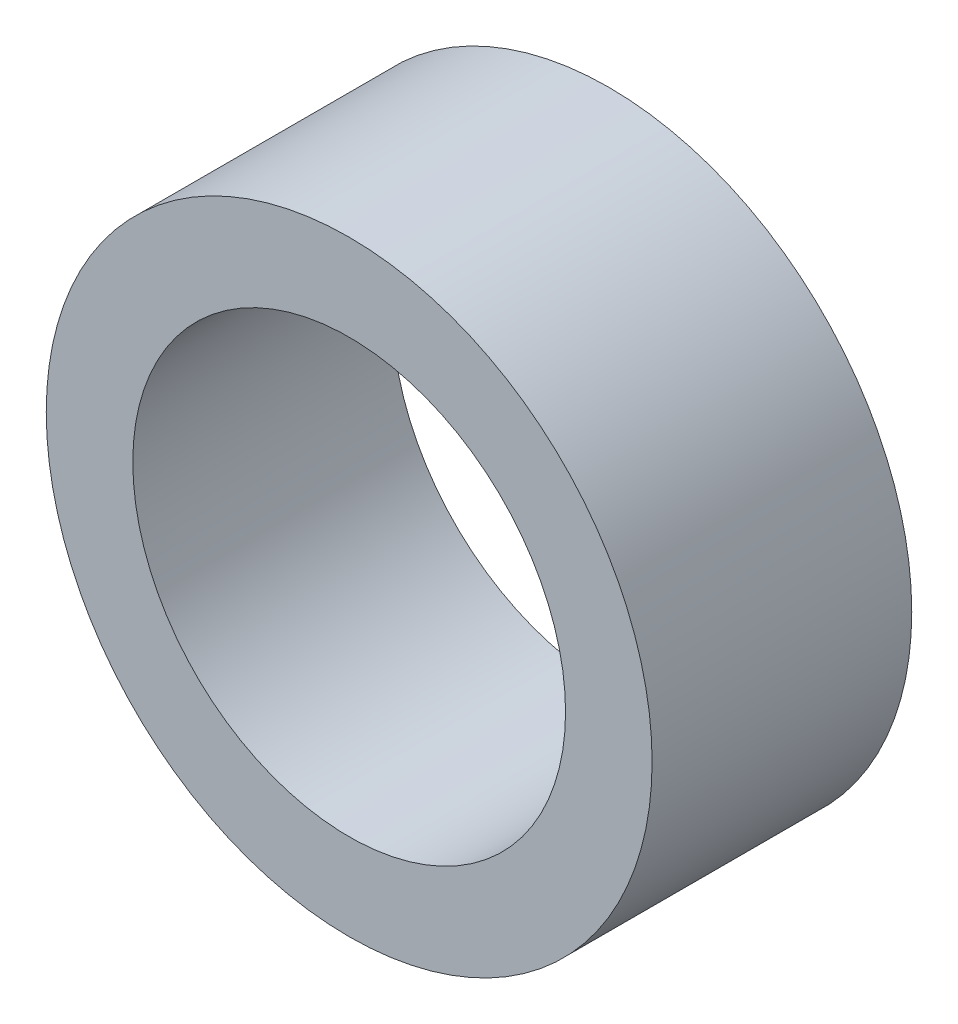
ISO-10303-21;
HEADER;
FILE_DESCRIPTION(('STEP AP214'),'2;1');
FILE_NAME('part.step','',(''),(''),'','','');
FILE_SCHEMA(('AUTOMOTIVE_DESIGN { 1 0 10303 214 1 1 1 1 }'));
ENDSEC;
DATA;
#1=APPLICATION_CONTEXT('core data for automotive mechanical design processes');
#2=APPLICATION_PROTOCOL_DEFINITION('international standard','automotive_design',2000,#1);
#3=PRODUCT_CONTEXT('',#1,'mechanical');
#4=PRODUCT('Part','Part','',(#3));
#5=PRODUCT_RELATED_PRODUCT_CATEGORY('part','',(#4));
#6=PRODUCT_DEFINITION_FORMATION('','',#4);
#7=PRODUCT_DEFINITION_CONTEXT('part definition',#1,'design');
#8=PRODUCT_DEFINITION('design','',#6,#7);
#9=PRODUCT_DEFINITION_SHAPE('','',#8);
#10=(LENGTH_UNIT() NAMED_UNIT(*) SI_UNIT(.MILLI.,.METRE.));
#11=(NAMED_UNIT(*) PLANE_ANGLE_UNIT() SI_UNIT($,.RADIAN.));
#12=(NAMED_UNIT(*) SI_UNIT($,.STERADIAN.) SOLID_ANGLE_UNIT());
#13=UNCERTAINTY_MEASURE_WITH_UNIT(LENGTH_MEASURE(1.E-05),#10,'distance_accuracy_value','');
#14=(GEOMETRIC_REPRESENTATION_CONTEXT(3) GLOBAL_UNCERTAINTY_ASSIGNED_CONTEXT((#13)) GLOBAL_UNIT_ASSIGNED_CONTEXT((#10,
#11,#12)) REPRESENTATION_CONTEXT('',''));
#15=CARTESIAN_POINT('',(0.,0.,0.));
#16=DIRECTION('',(0.,0.,1.));
#17=DIRECTION('',(1.,0.,0.));
#18=AXIS2_PLACEMENT_3D('',#15,#16,#17);
#19=CARTESIAN_POINT('',(0.,0.,-19.05));
#20=DIRECTION('',(0.,0.,1.));
#21=DIRECTION('',(1.,0.,0.));
#22=AXIS2_PLACEMENT_3D('',#19,#20,#21);
#23=CYLINDRICAL_SURFACE('',#22,44.45);
#24=CARTESIAN_POINT('',(0.,0.,-19.05));
#25=DIRECTION('',(0.,0.,1.));
#26=DIRECTION('',(1.,0.,0.));
#27=AXIS2_PLACEMENT_3D('',#24,#25,#26);
#28=CIRCLE('',#27,44.45);
#29=CARTESIAN_POINT('',(44.45,0.,-19.05));
#30=VERTEX_POINT('',#29);
#31=EDGE_CURVE('E10',#30,#30,#28,.T.);
#32=CARTESIAN_POINT('',(0.,0.,19.05));
#33=DIRECTION('',(0.,0.,1.));
#34=DIRECTION('',(1.,0.,0.));
#35=AXIS2_PLACEMENT_3D('',#32,#33,#34);
#36=CIRCLE('',#35,44.45);
#37=CARTESIAN_POINT('',(44.45,0.,19.05));
#38=VERTEX_POINT('',#37);
#39=EDGE_CURVE('E40',#38,#38,#36,.T.);
#40=CARTESIAN_POINT('',(44.45,0.,-19.05));
#41=CARTESIAN_POINT('',(44.45,0.,-18.653125));
#42=CARTESIAN_POINT('',(44.45,0.,-18.25625));
#43=CARTESIAN_POINT('',(44.45,0.,-17.4625));
#44=CARTESIAN_POINT('',(44.45,0.,-17.065625));
#45=CARTESIAN_POINT('',(44.45,0.,-16.271875));
#46=CARTESIAN_POINT('',(44.45,0.,-15.875));
#47=CARTESIAN_POINT('',(44.45,0.,-15.08125));
#48=CARTESIAN_POINT('',(44.45,0.,-14.684375));
#49=CARTESIAN_POINT('',(44.45,0.,-13.890625));
#50=CARTESIAN_POINT('',(44.45,0.,-13.49375));
#51=CARTESIAN_POINT('',(44.45,0.,-12.7));
#52=CARTESIAN_POINT('',(44.45,0.,-12.303125));
#53=CARTESIAN_POINT('',(44.45,0.,-11.509375));
#54=CARTESIAN_POINT('',(44.45,0.,-11.1125));
#55=CARTESIAN_POINT('',(44.45,0.,-10.31875));
#56=CARTESIAN_POINT('',(44.45,0.,-9.921875));
#57=CARTESIAN_POINT('',(44.45,0.,-9.128125));
#58=CARTESIAN_POINT('',(44.45,0.,-8.73125));
#59=CARTESIAN_POINT('',(44.45,0.,-7.9375));
#60=CARTESIAN_POINT('',(44.45,0.,-7.540625));
#61=CARTESIAN_POINT('',(44.45,0.,-6.746875));
#62=CARTESIAN_POINT('',(44.45,0.,-6.35));
#63=CARTESIAN_POINT('',(44.45,0.,-5.55625));
#64=CARTESIAN_POINT('',(44.45,0.,-5.159375));
#65=CARTESIAN_POINT('',(44.45,0.,-4.365625));
#66=CARTESIAN_POINT('',(44.45,0.,-3.96875));
#67=CARTESIAN_POINT('',(44.45,0.,-3.175));
#68=CARTESIAN_POINT('',(44.45,0.,-2.778125));
#69=CARTESIAN_POINT('',(44.45,0.,-1.984375));
#70=CARTESIAN_POINT('',(44.45,0.,-1.5875));
#71=CARTESIAN_POINT('',(44.45,0.,-0.79375));
#72=CARTESIAN_POINT('',(44.45,0.,-0.396875));
#73=CARTESIAN_POINT('',(44.45,0.,0.396875));
#74=CARTESIAN_POINT('',(44.45,0.,0.79375));
#75=CARTESIAN_POINT('',(44.45,0.,1.5875));
#76=CARTESIAN_POINT('',(44.45,0.,1.984375));
#77=CARTESIAN_POINT('',(44.45,0.,2.778125));
#78=CARTESIAN_POINT('',(44.45,0.,3.175));
#79=CARTESIAN_POINT('',(44.45,0.,3.96875));
#80=CARTESIAN_POINT('',(44.45,0.,4.365625));
#81=CARTESIAN_POINT('',(44.45,0.,5.159375));
#82=CARTESIAN_POINT('',(44.45,0.,5.55625));
#83=CARTESIAN_POINT('',(44.45,0.,6.35));
#84=CARTESIAN_POINT('',(44.45,0.,6.746875));
#85=CARTESIAN_POINT('',(44.45,0.,7.540625));
#86=CARTESIAN_POINT('',(44.45,0.,7.9375));
#87=CARTESIAN_POINT('',(44.45,0.,8.73125));
#88=CARTESIAN_POINT('',(44.45,0.,9.128125));
#89=CARTESIAN_POINT('',(44.45,0.,9.921875));
#90=CARTESIAN_POINT('',(44.45,0.,10.31875));
#91=CARTESIAN_POINT('',(44.45,0.,11.1125));
#92=CARTESIAN_POINT('',(44.45,0.,11.509375));
#93=CARTESIAN_POINT('',(44.45,0.,12.303125));
#94=CARTESIAN_POINT('',(44.45,0.,12.7));
#95=CARTESIAN_POINT('',(44.45,0.,13.49375));
#96=CARTESIAN_POINT('',(44.45,0.,13.890625));
#97=CARTESIAN_POINT('',(44.45,0.,14.684375));
#98=CARTESIAN_POINT('',(44.45,0.,15.08125));
#99=CARTESIAN_POINT('',(44.45,0.,15.875));
#100=CARTESIAN_POINT('',(44.45,0.,16.271875));
#101=CARTESIAN_POINT('',(44.45,0.,17.065625));
#102=CARTESIAN_POINT('',(44.45,0.,17.4625));
#103=CARTESIAN_POINT('',(44.45,0.,18.25625));
#104=CARTESIAN_POINT('',(44.45,0.,18.653125));
#105=CARTESIAN_POINT('',(44.45,0.,19.05));
#106=B_SPLINE_CURVE_WITH_KNOTS('',3,(#40,#41,#42,#43,#44,#45,#46,#47,#48,#49,#50,#51,#52,#53,
#54,#55,#56,#57,#58,#59,#60,#61,#62,#63,#64,#65,#66,#67,#68,#69,#70,#71,#72,#73,#74,#75,#76,#77,
#78,#79,#80,#81,#82,#83,#84,#85,#86,#87,#88,#89,#90,#91,#92,#93,#94,#95,#96,#97,#98,#99,#100,
#101,#102,#103,#104,#105),.UNSPECIFIED.,.F.,.F.,(4,2,2,2,2,2,2,2,2,2,2,2,2,2,2,2,2,2,2,2,2,2,2,
2,2,2,2,2,2,2,2,2,4),(0.,1.190625,2.38125,3.571875,4.7625,5.953125,7.14375,8.334375,9.525,
10.715625,11.90625,13.096875,14.2875,15.478125,16.66875,17.859375,19.05,20.240625,21.43125,
22.621875,23.8125,25.003125,26.19375,27.384375,28.575,29.765625,30.95625,32.146875,33.3375,
34.528125,35.71875,36.909375,38.1),.UNSPECIFIED.);
#107=EDGE_CURVE('BSEAM37',#30,#38,#106,.T.);
#108=ORIENTED_EDGE('',*,*,#31,.T.);
#109=ORIENTED_EDGE('',*,*,#39,.F.);
#110=ORIENTED_EDGE('',*,*,#107,.T.);
#111=ORIENTED_EDGE('',*,*,#107,.F.);
#112=EDGE_LOOP('',(#108,#110,#109,#111));
#113=FACE_BOUND('',#112,.T.);
#114=ADVANCED_FACE('F37',(#113),#23,.T.);
#115=CARTESIAN_POINT('',(0.,0.,-19.05));
#116=DIRECTION('',(0.,0.,1.));
#117=DIRECTION('',(1.,0.,0.));
#118=AXIS2_PLACEMENT_3D('',#115,#116,#117);
#119=PLANE('',#118);
#120=CARTESIAN_POINT('',(0.,0.,-19.05));
#121=DIRECTION('',(0.,0.,1.));
#122=DIRECTION('',(1.,0.,0.));
#123=AXIS2_PLACEMENT_3D('',#120,#121,#122);
#124=CIRCLE('',#123,31.75);
#125=CARTESIAN_POINT('',(31.75,0.,-19.05));
#126=VERTEX_POINT('',#125);
#127=EDGE_CURVE('E49',#126,#126,#124,.T.);
#128=ORIENTED_EDGE('',*,*,#127,.T.);
#129=EDGE_LOOP('',(#128));
#130=FACE_BOUND('',#129,.T.);
#131=ORIENTED_EDGE('',*,*,#31,.F.);
#132=EDGE_LOOP('',(#131));
#133=FACE_BOUND('',#132,.T.);
#134=ADVANCED_FACE('F59',(#130,#133),#119,.F.);
#135=CARTESIAN_POINT('',(0.,0.,19.05));
#136=DIRECTION('',(0.,0.,1.));
#137=DIRECTION('',(1.,0.,0.));
#138=AXIS2_PLACEMENT_3D('',#135,#136,#137);
#139=PLANE('',#138);
#140=CARTESIAN_POINT('',(0.,0.,19.05));
#141=DIRECTION('',(0.,0.,1.));
#142=DIRECTION('',(1.,0.,0.));
#143=AXIS2_PLACEMENT_3D('',#140,#141,#142);
#144=CIRCLE('',#143,31.75);
#145=CARTESIAN_POINT('',(31.75,0.,19.05));
#146=VERTEX_POINT('',#145);
#147=EDGE_CURVE('E51',#146,#146,#144,.T.);
#148=ORIENTED_EDGE('',*,*,#147,.F.);
#149=EDGE_LOOP('',(#148));
#150=FACE_BOUND('',#149,.T.);
#151=ORIENTED_EDGE('',*,*,#39,.T.);
#152=EDGE_LOOP('',(#151));
#153=FACE_BOUND('',#152,.T.);
#154=ADVANCED_FACE('F65',(#150,#153),#139,.T.);
#155=CARTESIAN_POINT('',(0.,0.,-19.05));
#156=DIRECTION('',(0.,0.,1.));
#157=DIRECTION('',(1.,0.,0.));
#158=AXIS2_PLACEMENT_3D('',#155,#156,#157);
#159=CYLINDRICAL_SURFACE('',#158,31.75);
#160=CARTESIAN_POINT('',(31.75,0.,-19.05));
#161=CARTESIAN_POINT('',(31.75,0.,-18.653125));
#162=CARTESIAN_POINT('',(31.75,0.,-18.25625));
#163=CARTESIAN_POINT('',(31.75,0.,-17.4625));
#164=CARTESIAN_POINT('',(31.75,0.,-17.065625));
#165=CARTESIAN_POINT('',(31.75,0.,-16.271875));
#166=CARTESIAN_POINT('',(31.75,0.,-15.875));
#167=CARTESIAN_POINT('',(31.75,0.,-15.08125));
#168=CARTESIAN_POINT('',(31.75,0.,-14.684375));
#169=CARTESIAN_POINT('',(31.75,0.,-13.890625));
#170=CARTESIAN_POINT('',(31.75,0.,-13.49375));
#171=CARTESIAN_POINT('',(31.75,0.,-12.7));
#172=CARTESIAN_POINT('',(31.75,0.,-12.303125));
#173=CARTESIAN_POINT('',(31.75,0.,-11.509375));
#174=CARTESIAN_POINT('',(31.75,0.,-11.1125));
#175=CARTESIAN_POINT('',(31.75,0.,-10.31875));
#176=CARTESIAN_POINT('',(31.75,0.,-9.921875));
#177=CARTESIAN_POINT('',(31.75,0.,-9.128125));
#178=CARTESIAN_POINT('',(31.75,0.,-8.73125));
#179=CARTESIAN_POINT('',(31.75,0.,-7.9375));
#180=CARTESIAN_POINT('',(31.75,0.,-7.540625));
#181=CARTESIAN_POINT('',(31.75,0.,-6.746875));
#182=CARTESIAN_POINT('',(31.75,0.,-6.35));
#183=CARTESIAN_POINT('',(31.75,0.,-5.55625));
#184=CARTESIAN_POINT('',(31.75,0.,-5.159375));
#185=CARTESIAN_POINT('',(31.75,0.,-4.365625));
#186=CARTESIAN_POINT('',(31.75,0.,-3.96875));
#187=CARTESIAN_POINT('',(31.75,0.,-3.175));
#188=CARTESIAN_POINT('',(31.75,0.,-2.778125));
#189=CARTESIAN_POINT('',(31.75,0.,-1.984375));
#190=CARTESIAN_POINT('',(31.75,0.,-1.5875));
#191=CARTESIAN_POINT('',(31.75,0.,-0.79375));
#192=CARTESIAN_POINT('',(31.75,0.,-0.396875));
#193=CARTESIAN_POINT('',(31.75,0.,0.396875));
#194=CARTESIAN_POINT('',(31.75,0.,0.79375));
#195=CARTESIAN_POINT('',(31.75,0.,1.5875));
#196=CARTESIAN_POINT('',(31.75,0.,1.984375));
#197=CARTESIAN_POINT('',(31.75,0.,2.778125));
#198=CARTESIAN_POINT('',(31.75,0.,3.175));
#199=CARTESIAN_POINT('',(31.75,0.,3.96875));
#200=CARTESIAN_POINT('',(31.75,0.,4.365625));
#201=CARTESIAN_POINT('',(31.75,0.,5.159375));
#202=CARTESIAN_POINT('',(31.75,0.,5.55625));
#203=CARTESIAN_POINT('',(31.75,0.,6.35));
#204=CARTESIAN_POINT('',(31.75,0.,6.746875));
#205=CARTESIAN_POINT('',(31.75,0.,7.540625));
#206=CARTESIAN_POINT('',(31.75,0.,7.9375));
#207=CARTESIAN_POINT('',(31.75,0.,8.73125));
#208=CARTESIAN_POINT('',(31.75,0.,9.128125));
#209=CARTESIAN_POINT('',(31.75,0.,9.921875));
#210=CARTESIAN_POINT('',(31.75,0.,10.31875));
#211=CARTESIAN_POINT('',(31.75,0.,11.1125));
#212=CARTESIAN_POINT('',(31.75,0.,11.509375));
#213=CARTESIAN_POINT('',(31.75,0.,12.303125));
#214=CARTESIAN_POINT('',(31.75,0.,12.7));
#215=CARTESIAN_POINT('',(31.75,0.,13.49375));
#216=CARTESIAN_POINT('',(31.75,0.,13.890625));
#217=CARTESIAN_POINT('',(31.75,0.,14.684375));
#218=CARTESIAN_POINT('',(31.75,0.,15.08125));
#219=CARTESIAN_POINT('',(31.75,0.,15.875));
#220=CARTESIAN_POINT('',(31.75,0.,16.271875));
#221=CARTESIAN_POINT('',(31.75,0.,17.065625));
#222=CARTESIAN_POINT('',(31.75,0.,17.4625));
#223=CARTESIAN_POINT('',(31.75,0.,18.25625));
#224=CARTESIAN_POINT('',(31.75,0.,18.653125));
#225=CARTESIAN_POINT('',(31.75,0.,19.05));
#226=B_SPLINE_CURVE_WITH_KNOTS('',3,(#160,#161,#162,#163,#164,#165,#166,#167,#168,#169,#170,
#171,#172,#173,#174,#175,#176,#177,#178,#179,#180,#181,#182,#183,#184,#185,#186,#187,#188,#189,
#190,#191,#192,#193,#194,#195,#196,#197,#198,#199,#200,#201,#202,#203,#204,#205,#206,#207,#208,
#209,#210,#211,#212,#213,#214,#215,#216,#217,#218,#219,#220,#221,#222,#223,#224,#225),
.UNSPECIFIED.,.F.,.F.,(4,2,2,2,2,2,2,2,2,2,2,2,2,2,2,2,2,2,2,2,2,2,2,2,2,2,2,2,2,2,2,2,4),(0.,
1.190625,2.38125,3.571875,4.7625,5.953125,7.14375,8.334375,9.525,10.715625,11.90625,13.096875,
14.2875,15.478125,16.66875,17.859375,19.05,20.240625,21.43125,22.621875,23.8125,25.003125,
26.19375,27.384375,28.575,29.765625,30.95625,32.146875,33.3375,34.528125,35.71875,36.909375,
38.1),.UNSPECIFIED.);
#227=EDGE_CURVE('BSEAM62',#126,#146,#226,.T.);
#228=ORIENTED_EDGE('',*,*,#127,.F.);
#229=ORIENTED_EDGE('',*,*,#147,.T.);
#230=ORIENTED_EDGE('',*,*,#227,.T.);
#231=ORIENTED_EDGE('',*,*,#227,.F.);
#232=EDGE_LOOP('',(#228,#230,#229,#231));
#233=FACE_BOUND('',#232,.T.);
#234=ADVANCED_FACE('F62',(#233),#159,.F.);
#235=CLOSED_SHELL('',(#114,#134,#154,#234));
#236=MANIFOLD_SOLID_BREP('B2',#235);
#237=ADVANCED_BREP_SHAPE_REPRESENTATION('',(#18,#236),#14);
#238=SHAPE_DEFINITION_REPRESENTATION(#9,#237);
ENDSEC;
END-ISO-10303-21;
